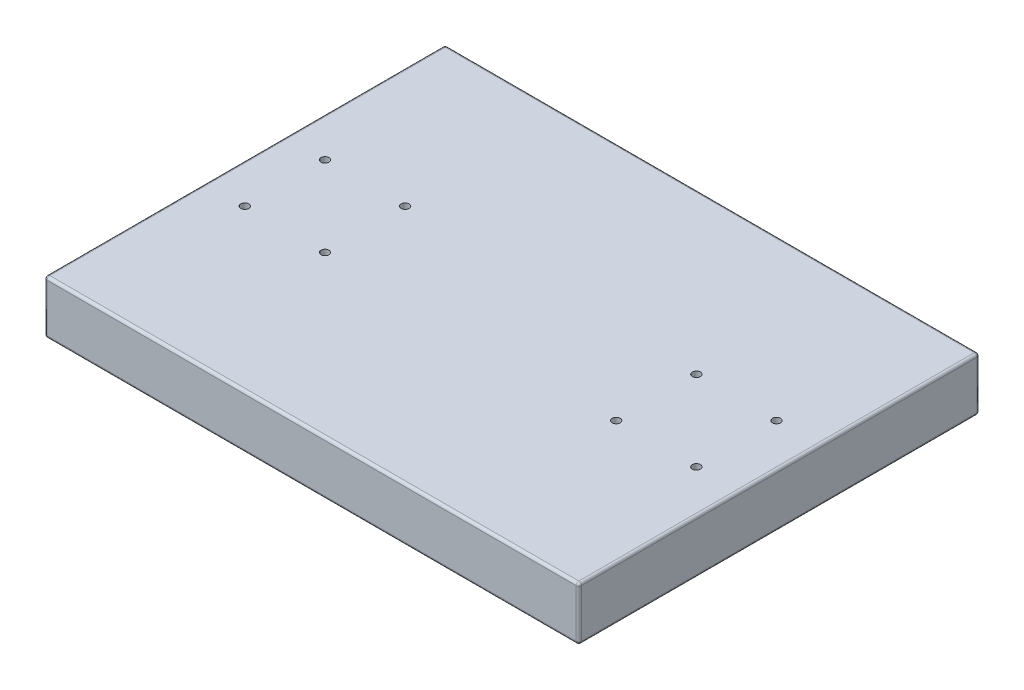
ISO-10303-21;
HEADER;
FILE_DESCRIPTION(('STEP AP214'),'2;1');
FILE_NAME('part.step','',(''),(''),'','','');
FILE_SCHEMA(('AUTOMOTIVE_DESIGN { 1 0 10303 214 1 1 1 1 }'));
ENDSEC;
DATA;
#1=APPLICATION_CONTEXT('core data for automotive mechanical design processes');
#2=APPLICATION_PROTOCOL_DEFINITION('international standard','automotive_design',2000,#1);
#3=PRODUCT_CONTEXT('',#1,'mechanical');
#4=PRODUCT('Part','Part','',(#3));
#5=PRODUCT_RELATED_PRODUCT_CATEGORY('part','',(#4));
#6=PRODUCT_DEFINITION_FORMATION('','',#4);
#7=PRODUCT_DEFINITION_CONTEXT('part definition',#1,'design');
#8=PRODUCT_DEFINITION('design','',#6,#7);
#9=PRODUCT_DEFINITION_SHAPE('','',#8);
#10=(LENGTH_UNIT() NAMED_UNIT(*) SI_UNIT(.MILLI.,.METRE.));
#11=(NAMED_UNIT(*) PLANE_ANGLE_UNIT() SI_UNIT($,.RADIAN.));
#12=(NAMED_UNIT(*) SI_UNIT($,.STERADIAN.) SOLID_ANGLE_UNIT());
#13=UNCERTAINTY_MEASURE_WITH_UNIT(LENGTH_MEASURE(1.E-05),#10,'distance_accuracy_value','');
#14=(GEOMETRIC_REPRESENTATION_CONTEXT(3) GLOBAL_UNCERTAINTY_ASSIGNED_CONTEXT((#13)) GLOBAL_UNIT_ASSIGNED_CONTEXT((#10,
#11,#12)) REPRESENTATION_CONTEXT('',''));
#15=CARTESIAN_POINT('',(0.,0.,0.));
#16=DIRECTION('',(0.,0.,1.));
#17=DIRECTION('',(1.,0.,0.));
#18=AXIS2_PLACEMENT_3D('',#15,#16,#17);
#19=CARTESIAN_POINT('',(100.,20.,75.));
#20=DIRECTION('',(-1.,0.,0.));
#21=DIRECTION('',(0.,0.,1.));
#22=AXIS2_PLACEMENT_3D('',#19,#20,#21);
#23=PLANE('',#22);
#24=DIRECTION('',(0.,0.,-1.));
#25=VECTOR('',#24,1.);
#26=CARTESIAN_POINT('',(100.,19.,75.));
#27=LINE('',#26,#25);
#28=CARTESIAN_POINT('',(100.,19.,-74.));
#29=VERTEX_POINT('',#28);
#30=CARTESIAN_POINT('',(100.,19.,74.));
#31=VERTEX_POINT('',#30);
#32=EDGE_CURVE('E175',#29,#31,#27,.F.);
#33=ORIENTED_EDGE('',*,*,#32,.T.);
#34=DIRECTION('',(0.,-1.,0.));
#35=VECTOR('',#34,1.);
#36=CARTESIAN_POINT('',(100.,20.,74.));
#37=LINE('',#36,#35);
#38=CARTESIAN_POINT('',(100.,1.,74.));
#39=VERTEX_POINT('',#38);
#40=EDGE_CURVE('E144',#31,#39,#37,.T.);
#41=ORIENTED_EDGE('',*,*,#40,.T.);
#42=DIRECTION('',(0.,0.,-1.));
#43=VECTOR('',#42,1.);
#44=CARTESIAN_POINT('',(100.,1.,-75.));
#45=LINE('',#44,#43);
#46=CARTESIAN_POINT('',(100.,1.,-74.));
#47=VERTEX_POINT('',#46);
#48=EDGE_CURVE('E164',#39,#47,#45,.T.);
#49=ORIENTED_EDGE('',*,*,#48,.T.);
#50=DIRECTION('',(0.,-1.,0.));
#51=VECTOR('',#50,1.);
#52=CARTESIAN_POINT('',(100.,20.,-74.));
#53=LINE('',#52,#51);
#54=EDGE_CURVE('E171',#47,#29,#53,.F.);
#55=ORIENTED_EDGE('',*,*,#54,.T.);
#56=EDGE_LOOP('',(#33,#41,#49,#55));
#57=FACE_BOUND('',#56,.T.);
#58=ADVANCED_FACE('F46',(#57),#23,.F.);
#59=CARTESIAN_POINT('',(-100.,20.,-75.));
#60=DIRECTION('',(0.,0.,1.));
#61=DIRECTION('',(1.,0.,0.));
#62=AXIS2_PLACEMENT_3D('',#59,#60,#61);
#63=PLANE('',#62);
#64=DIRECTION('',(0.,-1.,0.));
#65=VECTOR('',#64,1.);
#66=CARTESIAN_POINT('',(99.,20.,-75.));
#67=LINE('',#66,#65);
#68=CARTESIAN_POINT('',(99.,19.,-75.));
#69=VERTEX_POINT('',#68);
#70=CARTESIAN_POINT('',(99.,1.,-75.));
#71=VERTEX_POINT('',#70);
#72=EDGE_CURVE('E211',#69,#71,#67,.T.);
#73=ORIENTED_EDGE('',*,*,#72,.T.);
#74=DIRECTION('',(-1.,0.,0.));
#75=VECTOR('',#74,1.);
#76=CARTESIAN_POINT('',(-100.,1.,-75.));
#77=LINE('',#76,#75);
#78=CARTESIAN_POINT('',(-99.,1.,-75.));
#79=VERTEX_POINT('',#78);
#80=EDGE_CURVE('E215',#71,#79,#77,.T.);
#81=ORIENTED_EDGE('',*,*,#80,.T.);
#82=DIRECTION('',(0.,-1.,0.));
#83=VECTOR('',#82,1.);
#84=CARTESIAN_POINT('',(-99.,20.,-75.));
#85=LINE('',#84,#83);
#86=CARTESIAN_POINT('',(-99.,19.,-75.));
#87=VERTEX_POINT('',#86);
#88=EDGE_CURVE('E208',#79,#87,#85,.F.);
#89=ORIENTED_EDGE('',*,*,#88,.T.);
#90=DIRECTION('',(-1.,0.,0.));
#91=VECTOR('',#90,1.);
#92=CARTESIAN_POINT('',(-100.,19.,-75.));
#93=LINE('',#92,#91);
#94=EDGE_CURVE('E205',#87,#69,#93,.F.);
#95=ORIENTED_EDGE('',*,*,#94,.T.);
#96=EDGE_LOOP('',(#73,#81,#89,#95));
#97=FACE_BOUND('',#96,.T.);
#98=ADVANCED_FACE('F378',(#97),#63,.F.);
#99=CARTESIAN_POINT('',(-100.,20.,75.));
#100=DIRECTION('',(1.,0.,0.));
#101=DIRECTION('',(0.,0.,-1.));
#102=AXIS2_PLACEMENT_3D('',#99,#100,#101);
#103=PLANE('',#102);
#104=DIRECTION('',(0.,0.,1.));
#105=VECTOR('',#104,1.);
#106=CARTESIAN_POINT('',(-100.,1.,75.));
#107=LINE('',#106,#105);
#108=CARTESIAN_POINT('',(-100.,1.,-74.));
#109=VERTEX_POINT('',#108);
#110=CARTESIAN_POINT('',(-100.,1.,74.));
#111=VERTEX_POINT('',#110);
#112=EDGE_CURVE('E238',#109,#111,#107,.T.);
#113=ORIENTED_EDGE('',*,*,#112,.T.);
#114=DIRECTION('',(0.,-1.,0.));
#115=VECTOR('',#114,1.);
#116=CARTESIAN_POINT('',(-100.,20.,74.));
#117=LINE('',#116,#115);
#118=CARTESIAN_POINT('',(-100.,19.,74.));
#119=VERTEX_POINT('',#118);
#120=EDGE_CURVE('E11',#111,#119,#117,.F.);
#121=ORIENTED_EDGE('',*,*,#120,.T.);
#122=DIRECTION('',(0.,0.,1.));
#123=VECTOR('',#122,1.);
#124=CARTESIAN_POINT('',(-100.,19.,75.));
#125=LINE('',#124,#123);
#126=CARTESIAN_POINT('',(-100.,19.,-74.));
#127=VERTEX_POINT('',#126);
#128=EDGE_CURVE('E232',#119,#127,#125,.F.);
#129=ORIENTED_EDGE('',*,*,#128,.T.);
#130=DIRECTION('',(0.,-1.,0.));
#131=VECTOR('',#130,1.);
#132=CARTESIAN_POINT('',(-100.,20.,-74.));
#133=LINE('',#132,#131);
#134=EDGE_CURVE('E235',#127,#109,#133,.T.);
#135=ORIENTED_EDGE('',*,*,#134,.T.);
#136=EDGE_LOOP('',(#113,#121,#129,#135));
#137=FACE_BOUND('',#136,.T.);
#138=ADVANCED_FACE('F383',(#137),#103,.F.);
#139=CARTESIAN_POINT('',(-100.,20.,75.));
#140=DIRECTION('',(0.,0.,-1.));
#141=DIRECTION('',(-1.,0.,0.));
#142=AXIS2_PLACEMENT_3D('',#139,#140,#141);
#143=PLANE('',#142);
#144=DIRECTION('',(1.,0.,0.));
#145=VECTOR('',#144,1.);
#146=CARTESIAN_POINT('',(-100.,19.,75.));
#147=LINE('',#146,#145);
#148=CARTESIAN_POINT('',(99.,19.,75.));
#149=VERTEX_POINT('',#148);
#150=CARTESIAN_POINT('',(-99.,19.,75.));
#151=VERTEX_POINT('',#150);
#152=EDGE_CURVE('E178',#149,#151,#147,.F.);
#153=ORIENTED_EDGE('',*,*,#152,.T.);
#154=DIRECTION('',(0.,-1.,0.));
#155=VECTOR('',#154,1.);
#156=CARTESIAN_POINT('',(-99.,20.,75.));
#157=LINE('',#156,#155);
#158=CARTESIAN_POINT('',(-99.,1.,75.));
#159=VERTEX_POINT('',#158);
#160=EDGE_CURVE('E56',#151,#159,#157,.T.);
#161=ORIENTED_EDGE('',*,*,#160,.T.);
#162=DIRECTION('',(1.,0.,0.));
#163=VECTOR('',#162,1.);
#164=CARTESIAN_POINT('',(100.,1.,75.));
#165=LINE('',#164,#163);
#166=CARTESIAN_POINT('',(99.,1.,75.));
#167=VERTEX_POINT('',#166);
#168=EDGE_CURVE('E188',#159,#167,#165,.T.);
#169=ORIENTED_EDGE('',*,*,#168,.T.);
#170=DIRECTION('',(0.,-1.,0.));
#171=VECTOR('',#170,1.);
#172=CARTESIAN_POINT('',(99.,20.,75.));
#173=LINE('',#172,#171);
#174=EDGE_CURVE('E146',#167,#149,#173,.F.);
#175=ORIENTED_EDGE('',*,*,#174,.T.);
#176=EDGE_LOOP('',(#153,#161,#169,#175));
#177=FACE_BOUND('',#176,.T.);
#178=ADVANCED_FACE('F352',(#177),#143,.F.);
#179=CARTESIAN_POINT('',(0.,20.,0.));
#180=DIRECTION('',(0.,-1.,0.));
#181=DIRECTION('',(0.,0.,-1.));
#182=AXIS2_PLACEMENT_3D('',#179,#180,#181);
#183=PLANE('',#182);
#184=CARTESIAN_POINT('',(-55.,20.,-15.));
#185=DIRECTION('',(0.,1.,0.));
#186=DIRECTION('',(0.,0.,1.));
#187=AXIS2_PLACEMENT_3D('',#184,#185,#186);
#188=CIRCLE('',#187,1.5);
#189=CARTESIAN_POINT('',(-55.,20.,-13.5));
#190=VERTEX_POINT('',#189);
#191=EDGE_CURVE('E697',#190,#190,#188,.T.);
#192=ORIENTED_EDGE('',*,*,#191,.F.);
#193=EDGE_LOOP('',(#192));
#194=FACE_BOUND('',#193,.T.);
#195=CARTESIAN_POINT('',(-85.,20.,15.));
#196=DIRECTION('',(0.,1.,0.));
#197=DIRECTION('',(0.,0.,1.));
#198=AXIS2_PLACEMENT_3D('',#195,#196,#197);
#199=CIRCLE('',#198,1.5);
#200=CARTESIAN_POINT('',(-85.,20.,16.5));
#201=VERTEX_POINT('',#200);
#202=EDGE_CURVE('E706',#201,#201,#199,.T.);
#203=ORIENTED_EDGE('',*,*,#202,.F.);
#204=EDGE_LOOP('',(#203));
#205=FACE_BOUND('',#204,.T.);
#206=CARTESIAN_POINT('',(-55.,20.,15.));
#207=DIRECTION('',(0.,1.,0.));
#208=DIRECTION('',(0.,0.,1.));
#209=AXIS2_PLACEMENT_3D('',#206,#207,#208);
#210=CIRCLE('',#209,1.5);
#211=CARTESIAN_POINT('',(-55.,20.,16.5));
#212=VERTEX_POINT('',#211);
#213=EDGE_CURVE('E719',#212,#212,#210,.T.);
#214=ORIENTED_EDGE('',*,*,#213,.F.);
#215=EDGE_LOOP('',(#214));
#216=FACE_BOUND('',#215,.T.);
#217=CARTESIAN_POINT('',(-85.,20.,-15.));
#218=DIRECTION('',(0.,1.,0.));
#219=DIRECTION('',(0.,0.,1.));
#220=AXIS2_PLACEMENT_3D('',#217,#218,#219);
#221=CIRCLE('',#220,1.5);
#222=CARTESIAN_POINT('',(-85.,20.,-13.5));
#223=VERTEX_POINT('',#222);
#224=EDGE_CURVE('E699',#223,#223,#221,.T.);
#225=ORIENTED_EDGE('',*,*,#224,.F.);
#226=EDGE_LOOP('',(#225));
#227=FACE_BOUND('',#226,.T.);
#228=CARTESIAN_POINT('',(84.,20.,15.));
#229=DIRECTION('',(0.,1.,0.));
#230=DIRECTION('',(0.,0.,1.));
#231=AXIS2_PLACEMENT_3D('',#228,#229,#230);
#232=CIRCLE('',#231,1.5);
#233=CARTESIAN_POINT('',(84.,20.,16.5));
#234=VERTEX_POINT('',#233);
#235=EDGE_CURVE('E737',#234,#234,#232,.T.);
#236=ORIENTED_EDGE('',*,*,#235,.F.);
#237=EDGE_LOOP('',(#236));
#238=FACE_BOUND('',#237,.T.);
#239=CARTESIAN_POINT('',(54.,20.,15.));
#240=DIRECTION('',(0.,1.,0.));
#241=DIRECTION('',(0.,0.,1.));
#242=AXIS2_PLACEMENT_3D('',#239,#240,#241);
#243=CIRCLE('',#242,1.5);
#244=CARTESIAN_POINT('',(54.,20.,16.5));
#245=VERTEX_POINT('',#244);
#246=EDGE_CURVE('E730',#245,#245,#243,.T.);
#247=ORIENTED_EDGE('',*,*,#246,.F.);
#248=EDGE_LOOP('',(#247));
#249=FACE_BOUND('',#248,.T.);
#250=CARTESIAN_POINT('',(54.,20.,-15.));
#251=DIRECTION('',(0.,1.,0.));
#252=DIRECTION('',(0.,0.,1.));
#253=AXIS2_PLACEMENT_3D('',#250,#251,#252);
#254=CIRCLE('',#253,1.5);
#255=CARTESIAN_POINT('',(54.,20.,-13.5));
#256=VERTEX_POINT('',#255);
#257=EDGE_CURVE('E325',#256,#256,#254,.T.);
#258=ORIENTED_EDGE('',*,*,#257,.F.);
#259=EDGE_LOOP('',(#258));
#260=FACE_BOUND('',#259,.T.);
#261=CARTESIAN_POINT('',(84.,20.,-15.));
#262=DIRECTION('',(0.,1.,0.));
#263=DIRECTION('',(0.,0.,1.));
#264=AXIS2_PLACEMENT_3D('',#261,#262,#263);
#265=CIRCLE('',#264,1.5);
#266=CARTESIAN_POINT('',(84.,20.,-13.5));
#267=VERTEX_POINT('',#266);
#268=EDGE_CURVE('E319',#267,#267,#265,.T.);
#269=ORIENTED_EDGE('',*,*,#268,.F.);
#270=EDGE_LOOP('',(#269));
#271=FACE_BOUND('',#270,.T.);
#272=DIRECTION('',(1.,0.,0.));
#273=VECTOR('',#272,1.);
#274=CARTESIAN_POINT('',(0.,20.,74.));
#275=LINE('',#274,#273);
#276=CARTESIAN_POINT('',(-99.,20.,74.));
#277=VERTEX_POINT('',#276);
#278=CARTESIAN_POINT('',(99.,20.,74.));
#279=VERTEX_POINT('',#278);
#280=EDGE_CURVE('E198',#277,#279,#275,.T.);
#281=ORIENTED_EDGE('',*,*,#280,.T.);
#282=DIRECTION('',(0.,0.,-1.));
#283=VECTOR('',#282,1.);
#284=CARTESIAN_POINT('',(99.,20.,0.));
#285=LINE('',#284,#283);
#286=CARTESIAN_POINT('',(99.,20.,-74.));
#287=VERTEX_POINT('',#286);
#288=EDGE_CURVE('E201',#279,#287,#285,.T.);
#289=ORIENTED_EDGE('',*,*,#288,.T.);
#290=DIRECTION('',(-1.,0.,0.));
#291=VECTOR('',#290,1.);
#292=CARTESIAN_POINT('',(0.,20.,-74.));
#293=LINE('',#292,#291);
#294=CARTESIAN_POINT('',(-99.,20.,-74.));
#295=VERTEX_POINT('',#294);
#296=EDGE_CURVE('E195',#287,#295,#293,.T.);
#297=ORIENTED_EDGE('',*,*,#296,.T.);
#298=DIRECTION('',(0.,0.,1.));
#299=VECTOR('',#298,1.);
#300=CARTESIAN_POINT('',(-99.,20.,0.));
#301=LINE('',#300,#299);
#302=EDGE_CURVE('E191',#295,#277,#301,.T.);
#303=ORIENTED_EDGE('',*,*,#302,.T.);
#304=EDGE_LOOP('',(#281,#289,#297,#303));
#305=FACE_BOUND('',#304,.T.);
#306=ADVANCED_FACE('F479',(#194,#205,#216,#227,#238,#249,#260,#271,#305),#183,.F.);
#307=CARTESIAN_POINT('',(0.,0.,0.));
#308=DIRECTION('',(0.,-1.,0.));
#309=DIRECTION('',(0.,0.,-1.));
#310=AXIS2_PLACEMENT_3D('',#307,#308,#309);
#311=PLANE('',#310);
#312=CARTESIAN_POINT('',(-55.,0.,-15.));
#313=DIRECTION('',(0.,1.,0.));
#314=DIRECTION('',(0.,0.,1.));
#315=AXIS2_PLACEMENT_3D('',#312,#313,#314);
#316=CIRCLE('',#315,1.5);
#317=CARTESIAN_POINT('',(-55.,0.,-13.5));
#318=VERTEX_POINT('',#317);
#319=EDGE_CURVE('E694',#318,#318,#316,.T.);
#320=ORIENTED_EDGE('',*,*,#319,.T.);
#321=EDGE_LOOP('',(#320));
#322=FACE_BOUND('',#321,.T.);
#323=CARTESIAN_POINT('',(-85.,0.,15.));
#324=DIRECTION('',(0.,1.,0.));
#325=DIRECTION('',(0.,0.,1.));
#326=AXIS2_PLACEMENT_3D('',#323,#324,#325);
#327=CIRCLE('',#326,1.5);
#328=CARTESIAN_POINT('',(-85.,0.,16.5));
#329=VERTEX_POINT('',#328);
#330=EDGE_CURVE('E715',#329,#329,#327,.T.);
#331=ORIENTED_EDGE('',*,*,#330,.T.);
#332=EDGE_LOOP('',(#331));
#333=FACE_BOUND('',#332,.T.);
#334=CARTESIAN_POINT('',(-55.,0.,15.));
#335=DIRECTION('',(0.,1.,0.));
#336=DIRECTION('',(0.,0.,1.));
#337=AXIS2_PLACEMENT_3D('',#334,#335,#336);
#338=CIRCLE('',#337,1.5);
#339=CARTESIAN_POINT('',(-55.,0.,16.5));
#340=VERTEX_POINT('',#339);
#341=EDGE_CURVE('E709',#340,#340,#338,.T.);
#342=ORIENTED_EDGE('',*,*,#341,.T.);
#343=EDGE_LOOP('',(#342));
#344=FACE_BOUND('',#343,.T.);
#345=CARTESIAN_POINT('',(-85.,0.,-15.));
#346=DIRECTION('',(0.,1.,0.));
#347=DIRECTION('',(0.,0.,1.));
#348=AXIS2_PLACEMENT_3D('',#345,#346,#347);
#349=CIRCLE('',#348,1.5);
#350=CARTESIAN_POINT('',(-85.,0.,-13.5));
#351=VERTEX_POINT('',#350);
#352=EDGE_CURVE('E704',#351,#351,#349,.T.);
#353=ORIENTED_EDGE('',*,*,#352,.T.);
#354=EDGE_LOOP('',(#353));
#355=FACE_BOUND('',#354,.T.);
#356=CARTESIAN_POINT('',(84.,0.,15.));
#357=DIRECTION('',(0.,1.,0.));
#358=DIRECTION('',(0.,0.,1.));
#359=AXIS2_PLACEMENT_3D('',#356,#357,#358);
#360=CIRCLE('',#359,1.5);
#361=CARTESIAN_POINT('',(84.,0.,16.5));
#362=VERTEX_POINT('',#361);
#363=EDGE_CURVE('E328',#362,#362,#360,.T.);
#364=ORIENTED_EDGE('',*,*,#363,.T.);
#365=EDGE_LOOP('',(#364));
#366=FACE_BOUND('',#365,.T.);
#367=CARTESIAN_POINT('',(54.,0.,15.));
#368=DIRECTION('',(0.,1.,0.));
#369=DIRECTION('',(0.,0.,1.));
#370=AXIS2_PLACEMENT_3D('',#367,#368,#369);
#371=CIRCLE('',#370,1.5);
#372=CARTESIAN_POINT('',(54.,0.,16.5));
#373=VERTEX_POINT('',#372);
#374=EDGE_CURVE('E734',#373,#373,#371,.T.);
#375=ORIENTED_EDGE('',*,*,#374,.T.);
#376=EDGE_LOOP('',(#375));
#377=FACE_BOUND('',#376,.T.);
#378=CARTESIAN_POINT('',(54.,0.,-15.));
#379=DIRECTION('',(0.,1.,0.));
#380=DIRECTION('',(0.,0.,1.));
#381=AXIS2_PLACEMENT_3D('',#378,#379,#380);
#382=CIRCLE('',#381,1.5);
#383=CARTESIAN_POINT('',(54.,0.,-13.5));
#384=VERTEX_POINT('',#383);
#385=EDGE_CURVE('E726',#384,#384,#382,.T.);
#386=ORIENTED_EDGE('',*,*,#385,.T.);
#387=EDGE_LOOP('',(#386));
#388=FACE_BOUND('',#387,.T.);
#389=CARTESIAN_POINT('',(84.,0.,-15.));
#390=DIRECTION('',(0.,1.,0.));
#391=DIRECTION('',(0.,0.,1.));
#392=AXIS2_PLACEMENT_3D('',#389,#390,#391);
#393=CIRCLE('',#392,1.5);
#394=CARTESIAN_POINT('',(84.,0.,-13.5));
#395=VERTEX_POINT('',#394);
#396=EDGE_CURVE('E310',#395,#395,#393,.T.);
#397=ORIENTED_EDGE('',*,*,#396,.T.);
#398=EDGE_LOOP('',(#397));
#399=FACE_BOUND('',#398,.T.);
#400=DIRECTION('',(0.,0.,1.));
#401=VECTOR('',#400,1.);
#402=CARTESIAN_POINT('',(-99.,0.,-75.));
#403=LINE('',#402,#401);
#404=CARTESIAN_POINT('',(-99.,0.,74.));
#405=VERTEX_POINT('',#404);
#406=CARTESIAN_POINT('',(-99.,0.,-74.));
#407=VERTEX_POINT('',#406);
#408=EDGE_CURVE('E222',#405,#407,#403,.F.);
#409=ORIENTED_EDGE('',*,*,#408,.T.);
#410=DIRECTION('',(-1.,0.,0.));
#411=VECTOR('',#410,1.);
#412=CARTESIAN_POINT('',(100.,0.,-74.));
#413=LINE('',#412,#411);
#414=CARTESIAN_POINT('',(99.,0.,-74.));
#415=VERTEX_POINT('',#414);
#416=EDGE_CURVE('E229',#407,#415,#413,.F.);
#417=ORIENTED_EDGE('',*,*,#416,.T.);
#418=DIRECTION('',(0.,0.,-1.));
#419=VECTOR('',#418,1.);
#420=CARTESIAN_POINT('',(99.,0.,75.));
#421=LINE('',#420,#419);
#422=CARTESIAN_POINT('',(99.,0.,74.));
#423=VERTEX_POINT('',#422);
#424=EDGE_CURVE('E225',#415,#423,#421,.F.);
#425=ORIENTED_EDGE('',*,*,#424,.T.);
#426=DIRECTION('',(1.,0.,0.));
#427=VECTOR('',#426,1.);
#428=CARTESIAN_POINT('',(-100.,0.,74.));
#429=LINE('',#428,#427);
#430=EDGE_CURVE('E218',#423,#405,#429,.F.);
#431=ORIENTED_EDGE('',*,*,#430,.T.);
#432=EDGE_LOOP('',(#409,#417,#425,#431));
#433=FACE_BOUND('',#432,.T.);
#434=ADVANCED_FACE('F357',(#322,#333,#344,#355,#366,#377,#388,#399,#433),#311,.T.);
#435=CARTESIAN_POINT('',(-99.,20.,-74.));
#436=DIRECTION('',(0.,-1.,0.));
#437=DIRECTION('',(0.,0.,-1.));
#438=AXIS2_PLACEMENT_3D('',#435,#436,#437);
#439=CYLINDRICAL_SURFACE('',#438,1.);
#440=CARTESIAN_POINT('',(-99.,19.,-74.));
#441=DIRECTION('',(0.,1.,0.));
#442=DIRECTION('',(0.,0.,1.));
#443=AXIS2_PLACEMENT_3D('',#440,#441,#442);
#444=CIRCLE('',#443,1.);
#445=EDGE_CURVE('E172',#87,#127,#444,.T.);
#446=ORIENTED_EDGE('',*,*,#445,.F.);
#447=ORIENTED_EDGE('',*,*,#88,.F.);
#448=CARTESIAN_POINT('',(-99.,1.,-74.));
#449=DIRECTION('',(0.,-1.,0.));
#450=DIRECTION('',(0.,0.,-1.));
#451=AXIS2_PLACEMENT_3D('',#448,#449,#450);
#452=CIRCLE('',#451,1.);
#453=EDGE_CURVE('E281',#109,#79,#452,.T.);
#454=ORIENTED_EDGE('',*,*,#453,.F.);
#455=ORIENTED_EDGE('',*,*,#134,.F.);
#456=EDGE_LOOP('',(#446,#447,#454,#455));
#457=FACE_BOUND('',#456,.T.);
#458=ADVANCED_FACE('F492',(#457),#439,.T.);
#459=CARTESIAN_POINT('',(-99.,19.,-74.));
#460=DIRECTION('',(0.,0.,-1.));
#461=DIRECTION('',(-1.,0.,0.));
#462=AXIS2_PLACEMENT_3D('',#459,#460,#461);
#463=SPHERICAL_SURFACE('',#462,1.);
#464=CARTESIAN_POINT('',(-99.,19.,-74.));
#465=DIRECTION('',(0.,0.,-1.));
#466=DIRECTION('',(-1.,0.,0.));
#467=AXIS2_PLACEMENT_3D('',#464,#465,#466);
#468=CIRCLE('',#467,1.);
#469=EDGE_CURVE('E277',#295,#127,#468,.F.);
#470=ORIENTED_EDGE('',*,*,#469,.F.);
#471=CARTESIAN_POINT('',(-99.,19.,-74.));
#472=DIRECTION('',(-1.,0.,0.));
#473=DIRECTION('',(0.,0.,1.));
#474=AXIS2_PLACEMENT_3D('',#471,#472,#473);
#475=CIRCLE('',#474,1.);
#476=EDGE_CURVE('E289',#87,#295,#475,.F.);
#477=ORIENTED_EDGE('',*,*,#476,.F.);
#478=ORIENTED_EDGE('',*,*,#445,.T.);
#479=EDGE_LOOP('',(#470,#477,#478));
#480=FACE_BOUND('',#479,.T.);
#481=ADVANCED_FACE('F619',(#480),#463,.T.);
#482=CARTESIAN_POINT('',(0.,19.,-74.));
#483=DIRECTION('',(-1.,0.,0.));
#484=DIRECTION('',(0.,0.,1.));
#485=AXIS2_PLACEMENT_3D('',#482,#483,#484);
#486=CYLINDRICAL_SURFACE('',#485,1.);
#487=ORIENTED_EDGE('',*,*,#476,.T.);
#488=ORIENTED_EDGE('',*,*,#296,.F.);
#489=CARTESIAN_POINT('',(99.,19.,-74.));
#490=DIRECTION('',(1.,0.,0.));
#491=DIRECTION('',(0.,0.,-1.));
#492=AXIS2_PLACEMENT_3D('',#489,#490,#491);
#493=CIRCLE('',#492,1.);
#494=EDGE_CURVE('E273',#69,#287,#493,.T.);
#495=ORIENTED_EDGE('',*,*,#494,.F.);
#496=ORIENTED_EDGE('',*,*,#94,.F.);
#497=EDGE_LOOP('',(#487,#488,#495,#496));
#498=FACE_BOUND('',#497,.T.);
#499=ADVANCED_FACE('F611',(#498),#486,.T.);
#500=CARTESIAN_POINT('',(99.,20.,-74.));
#501=DIRECTION('',(0.,-1.,0.));
#502=DIRECTION('',(0.,0.,-1.));
#503=AXIS2_PLACEMENT_3D('',#500,#501,#502);
#504=CYLINDRICAL_SURFACE('',#503,1.);
#505=CARTESIAN_POINT('',(99.,1.,-74.));
#506=DIRECTION('',(0.,-1.,0.));
#507=DIRECTION('',(0.,0.,-1.));
#508=AXIS2_PLACEMENT_3D('',#505,#506,#507);
#509=CIRCLE('',#508,1.);
#510=EDGE_CURVE('E265',#71,#47,#509,.T.);
#511=ORIENTED_EDGE('',*,*,#510,.F.);
#512=ORIENTED_EDGE('',*,*,#72,.F.);
#513=CARTESIAN_POINT('',(99.,19.,-74.));
#514=DIRECTION('',(0.,1.,0.));
#515=DIRECTION('',(0.,0.,1.));
#516=AXIS2_PLACEMENT_3D('',#513,#514,#515);
#517=CIRCLE('',#516,1.);
#518=EDGE_CURVE('E269',#29,#69,#517,.T.);
#519=ORIENTED_EDGE('',*,*,#518,.F.);
#520=ORIENTED_EDGE('',*,*,#54,.F.);
#521=EDGE_LOOP('',(#511,#512,#519,#520));
#522=FACE_BOUND('',#521,.T.);
#523=ADVANCED_FACE('F336',(#522),#504,.T.);
#524=CARTESIAN_POINT('',(-100.,1.,-74.));
#525=DIRECTION('',(1.,0.,0.));
#526=DIRECTION('',(0.,0.,-1.));
#527=AXIS2_PLACEMENT_3D('',#524,#525,#526);
#528=CYLINDRICAL_SURFACE('',#527,1.);
#529=CARTESIAN_POINT('',(-99.,1.,-74.));
#530=DIRECTION('',(-1.,0.,0.));
#531=DIRECTION('',(0.,0.,1.));
#532=AXIS2_PLACEMENT_3D('',#529,#530,#531);
#533=CIRCLE('',#532,1.);
#534=EDGE_CURVE('E285',#79,#407,#533,.T.);
#535=ORIENTED_EDGE('',*,*,#534,.F.);
#536=ORIENTED_EDGE('',*,*,#80,.F.);
#537=CARTESIAN_POINT('',(99.,1.,-74.));
#538=DIRECTION('',(1.,0.,0.));
#539=DIRECTION('',(0.,0.,-1.));
#540=AXIS2_PLACEMENT_3D('',#537,#538,#539);
#541=CIRCLE('',#540,1.);
#542=EDGE_CURVE('E262',#415,#71,#541,.T.);
#543=ORIENTED_EDGE('',*,*,#542,.F.);
#544=ORIENTED_EDGE('',*,*,#416,.F.);
#545=EDGE_LOOP('',(#535,#536,#543,#544));
#546=FACE_BOUND('',#545,.T.);
#547=ADVANCED_FACE('F363',(#546),#528,.T.);
#548=CARTESIAN_POINT('',(-99.,1.,-74.));
#549=DIRECTION('',(0.,0.,-1.));
#550=DIRECTION('',(0.,1.,0.));
#551=AXIS2_PLACEMENT_3D('',#548,#549,#550);
#552=SPHERICAL_SURFACE('',#551,1.);
#553=ORIENTED_EDGE('',*,*,#453,.T.);
#554=ORIENTED_EDGE('',*,*,#534,.T.);
#555=CARTESIAN_POINT('',(-99.,1.,-74.));
#556=DIRECTION('',(0.,0.,-1.));
#557=DIRECTION('',(-1.,0.,0.));
#558=AXIS2_PLACEMENT_3D('',#555,#556,#557);
#559=CIRCLE('',#558,1.);
#560=EDGE_CURVE('E258',#109,#407,#559,.F.);
#561=ORIENTED_EDGE('',*,*,#560,.F.);
#562=EDGE_LOOP('',(#553,#554,#561));
#563=FACE_BOUND('',#562,.T.);
#564=ADVANCED_FACE('F587',(#563),#552,.T.);
#565=CARTESIAN_POINT('',(-99.,19.,0.));
#566=DIRECTION('',(0.,0.,1.));
#567=DIRECTION('',(1.,0.,0.));
#568=AXIS2_PLACEMENT_3D('',#565,#566,#567);
#569=CYLINDRICAL_SURFACE('',#568,1.);
#570=ORIENTED_EDGE('',*,*,#128,.F.);
#571=CARTESIAN_POINT('',(-99.,19.,74.));
#572=DIRECTION('',(0.,0.,1.));
#573=DIRECTION('',(1.,0.,0.));
#574=AXIS2_PLACEMENT_3D('',#571,#572,#573);
#575=CIRCLE('',#574,1.);
#576=EDGE_CURVE('E299',#119,#277,#575,.F.);
#577=ORIENTED_EDGE('',*,*,#576,.T.);
#578=ORIENTED_EDGE('',*,*,#302,.F.);
#579=ORIENTED_EDGE('',*,*,#469,.T.);
#580=EDGE_LOOP('',(#570,#577,#578,#579));
#581=FACE_BOUND('',#580,.T.);
#582=ADVANCED_FACE('F375',(#581),#569,.T.);
#583=CARTESIAN_POINT('',(99.,19.,-74.));
#584=DIRECTION('',(0.,0.,-1.));
#585=DIRECTION('',(-1.,0.,0.));
#586=AXIS2_PLACEMENT_3D('',#583,#584,#585);
#587=SPHERICAL_SURFACE('',#586,1.);
#588=ORIENTED_EDGE('',*,*,#518,.T.);
#589=ORIENTED_EDGE('',*,*,#494,.T.);
#590=CARTESIAN_POINT('',(99.,19.,-74.));
#591=DIRECTION('',(0.,0.,-1.));
#592=DIRECTION('',(-1.,0.,0.));
#593=AXIS2_PLACEMENT_3D('',#590,#591,#592);
#594=CIRCLE('',#593,1.);
#595=EDGE_CURVE('E255',#29,#287,#594,.F.);
#596=ORIENTED_EDGE('',*,*,#595,.F.);
#597=EDGE_LOOP('',(#588,#589,#596));
#598=FACE_BOUND('',#597,.T.);
#599=ADVANCED_FACE('F339',(#598),#587,.T.);
#600=CARTESIAN_POINT('',(99.,1.,-74.));
#601=DIRECTION('',(0.,0.,-1.));
#602=DIRECTION('',(0.,1.,0.));
#603=AXIS2_PLACEMENT_3D('',#600,#601,#602);
#604=SPHERICAL_SURFACE('',#603,1.);
#605=ORIENTED_EDGE('',*,*,#542,.T.);
#606=ORIENTED_EDGE('',*,*,#510,.T.);
#607=CARTESIAN_POINT('',(99.,1.,-74.));
#608=DIRECTION('',(0.,0.,-1.));
#609=DIRECTION('',(-1.,0.,0.));
#610=AXIS2_PLACEMENT_3D('',#607,#608,#609);
#611=CIRCLE('',#610,1.);
#612=EDGE_CURVE('E167',#415,#47,#611,.F.);
#613=ORIENTED_EDGE('',*,*,#612,.F.);
#614=EDGE_LOOP('',(#605,#606,#613));
#615=FACE_BOUND('',#614,.T.);
#616=ADVANCED_FACE('F365',(#615),#604,.T.);
#617=CARTESIAN_POINT('',(-99.,1.,75.));
#618=DIRECTION('',(0.,0.,-1.));
#619=DIRECTION('',(-1.,0.,0.));
#620=AXIS2_PLACEMENT_3D('',#617,#618,#619);
#621=CYLINDRICAL_SURFACE('',#620,1.);
#622=ORIENTED_EDGE('',*,*,#408,.F.);
#623=CARTESIAN_POINT('',(-99.,1.,74.));
#624=DIRECTION('',(0.,0.,-1.));
#625=DIRECTION('',(-1.,0.,0.));
#626=AXIS2_PLACEMENT_3D('',#623,#624,#625);
#627=CIRCLE('',#626,1.);
#628=EDGE_CURVE('E64',#405,#111,#627,.T.);
#629=ORIENTED_EDGE('',*,*,#628,.T.);
#630=ORIENTED_EDGE('',*,*,#112,.F.);
#631=ORIENTED_EDGE('',*,*,#560,.T.);
#632=EDGE_LOOP('',(#622,#629,#630,#631));
#633=FACE_BOUND('',#632,.T.);
#634=ADVANCED_FACE('F367',(#633),#621,.T.);
#635=CARTESIAN_POINT('',(0.,19.,74.));
#636=DIRECTION('',(1.,0.,0.));
#637=DIRECTION('',(0.,0.,-1.));
#638=AXIS2_PLACEMENT_3D('',#635,#636,#637);
#639=CYLINDRICAL_SURFACE('',#638,1.);
#640=ORIENTED_EDGE('',*,*,#280,.F.);
#641=CARTESIAN_POINT('',(-99.,19.,74.));
#642=DIRECTION('',(1.,0.,0.));
#643=DIRECTION('',(0.,0.,-1.));
#644=AXIS2_PLACEMENT_3D('',#641,#642,#643);
#645=CIRCLE('',#644,1.);
#646=EDGE_CURVE('E240',#277,#151,#645,.T.);
#647=ORIENTED_EDGE('',*,*,#646,.T.);
#648=ORIENTED_EDGE('',*,*,#152,.F.);
#649=CARTESIAN_POINT('',(99.,19.,74.));
#650=DIRECTION('',(1.,0.,0.));
#651=DIRECTION('',(0.,0.,-1.));
#652=AXIS2_PLACEMENT_3D('',#649,#650,#651);
#653=CIRCLE('',#652,1.);
#654=EDGE_CURVE('E249',#279,#149,#653,.T.);
#655=ORIENTED_EDGE('',*,*,#654,.F.);
#656=EDGE_LOOP('',(#640,#647,#648,#655));
#657=FACE_BOUND('',#656,.T.);
#658=ADVANCED_FACE('F351',(#657),#639,.T.);
#659=CARTESIAN_POINT('',(99.,19.,0.));
#660=DIRECTION('',(0.,0.,-1.));
#661=DIRECTION('',(-1.,0.,0.));
#662=AXIS2_PLACEMENT_3D('',#659,#660,#661);
#663=CYLINDRICAL_SURFACE('',#662,1.);
#664=ORIENTED_EDGE('',*,*,#595,.T.);
#665=ORIENTED_EDGE('',*,*,#288,.F.);
#666=CARTESIAN_POINT('',(99.,19.,74.));
#667=DIRECTION('',(0.,0.,1.));
#668=DIRECTION('',(1.,0.,0.));
#669=AXIS2_PLACEMENT_3D('',#666,#667,#668);
#670=CIRCLE('',#669,1.);
#671=EDGE_CURVE('E161',#31,#279,#670,.T.);
#672=ORIENTED_EDGE('',*,*,#671,.F.);
#673=ORIENTED_EDGE('',*,*,#32,.F.);
#674=EDGE_LOOP('',(#664,#665,#672,#673));
#675=FACE_BOUND('',#674,.T.);
#676=ADVANCED_FACE('F343',(#675),#663,.T.);
#677=CARTESIAN_POINT('',(99.,1.,75.));
#678=DIRECTION('',(0.,0.,1.));
#679=DIRECTION('',(1.,0.,0.));
#680=AXIS2_PLACEMENT_3D('',#677,#678,#679);
#681=CYLINDRICAL_SURFACE('',#680,1.);
#682=ORIENTED_EDGE('',*,*,#612,.T.);
#683=ORIENTED_EDGE('',*,*,#48,.F.);
#684=CARTESIAN_POINT('',(99.,1.,74.));
#685=DIRECTION('',(0.,0.,1.));
#686=DIRECTION('',(1.,0.,0.));
#687=AXIS2_PLACEMENT_3D('',#684,#685,#686);
#688=CIRCLE('',#687,1.);
#689=EDGE_CURVE('E152',#423,#39,#688,.T.);
#690=ORIENTED_EDGE('',*,*,#689,.F.);
#691=ORIENTED_EDGE('',*,*,#424,.F.);
#692=EDGE_LOOP('',(#682,#683,#690,#691));
#693=FACE_BOUND('',#692,.T.);
#694=ADVANCED_FACE('F165',(#693),#681,.T.);
#695=CARTESIAN_POINT('',(-100.,1.,74.));
#696=DIRECTION('',(-1.,0.,0.));
#697=DIRECTION('',(0.,0.,1.));
#698=AXIS2_PLACEMENT_3D('',#695,#696,#697);
#699=CYLINDRICAL_SURFACE('',#698,1.);
#700=ORIENTED_EDGE('',*,*,#168,.F.);
#701=CARTESIAN_POINT('',(-99.,1.,74.));
#702=DIRECTION('',(-1.,0.,0.));
#703=DIRECTION('',(0.,0.,1.));
#704=AXIS2_PLACEMENT_3D('',#701,#702,#703);
#705=CIRCLE('',#704,1.);
#706=EDGE_CURVE('E302',#159,#405,#705,.F.);
#707=ORIENTED_EDGE('',*,*,#706,.T.);
#708=ORIENTED_EDGE('',*,*,#430,.F.);
#709=CARTESIAN_POINT('',(99.,1.,74.));
#710=DIRECTION('',(1.,0.,0.));
#711=DIRECTION('',(0.,0.,-1.));
#712=AXIS2_PLACEMENT_3D('',#709,#710,#711);
#713=CIRCLE('',#712,1.);
#714=EDGE_CURVE('E156',#167,#423,#713,.T.);
#715=ORIENTED_EDGE('',*,*,#714,.F.);
#716=EDGE_LOOP('',(#700,#707,#708,#715));
#717=FACE_BOUND('',#716,.T.);
#718=ADVANCED_FACE('F355',(#717),#699,.T.);
#719=CARTESIAN_POINT('',(99.,19.,74.));
#720=DIRECTION('',(0.,1.,0.));
#721=DIRECTION('',(0.,0.,1.));
#722=AXIS2_PLACEMENT_3D('',#719,#720,#721);
#723=SPHERICAL_SURFACE('',#722,1.);
#724=ORIENTED_EDGE('',*,*,#671,.T.);
#725=ORIENTED_EDGE('',*,*,#654,.T.);
#726=CARTESIAN_POINT('',(99.,19.,74.));
#727=DIRECTION('',(0.,1.,0.));
#728=DIRECTION('',(0.,0.,1.));
#729=AXIS2_PLACEMENT_3D('',#726,#727,#728);
#730=CIRCLE('',#729,1.);
#731=EDGE_CURVE('E149',#31,#149,#730,.F.);
#732=ORIENTED_EDGE('',*,*,#731,.F.);
#733=EDGE_LOOP('',(#724,#725,#732));
#734=FACE_BOUND('',#733,.T.);
#735=ADVANCED_FACE('F347',(#734),#723,.T.);
#736=CARTESIAN_POINT('',(99.,1.,74.));
#737=DIRECTION('',(0.,-1.,0.));
#738=DIRECTION('',(0.,0.,-1.));
#739=AXIS2_PLACEMENT_3D('',#736,#737,#738);
#740=SPHERICAL_SURFACE('',#739,1.);
#741=ORIENTED_EDGE('',*,*,#714,.T.);
#742=ORIENTED_EDGE('',*,*,#689,.T.);
#743=CARTESIAN_POINT('',(99.,1.,74.));
#744=DIRECTION('',(0.,-1.,0.));
#745=DIRECTION('',(0.,0.,-1.));
#746=AXIS2_PLACEMENT_3D('',#743,#744,#745);
#747=CIRCLE('',#746,1.);
#748=EDGE_CURVE('E140',#167,#39,#747,.F.);
#749=ORIENTED_EDGE('',*,*,#748,.F.);
#750=EDGE_LOOP('',(#741,#742,#749));
#751=FACE_BOUND('',#750,.T.);
#752=ADVANCED_FACE('F154',(#751),#740,.T.);
#753=CARTESIAN_POINT('',(99.,20.,74.));
#754=DIRECTION('',(0.,-1.,0.));
#755=DIRECTION('',(0.,0.,-1.));
#756=AXIS2_PLACEMENT_3D('',#753,#754,#755);
#757=CYLINDRICAL_SURFACE('',#756,1.);
#758=ORIENTED_EDGE('',*,*,#731,.T.);
#759=ORIENTED_EDGE('',*,*,#174,.F.);
#760=ORIENTED_EDGE('',*,*,#748,.T.);
#761=ORIENTED_EDGE('',*,*,#40,.F.);
#762=EDGE_LOOP('',(#758,#759,#760,#761));
#763=FACE_BOUND('',#762,.T.);
#764=ADVANCED_FACE('F142',(#763),#757,.T.);
#765=CARTESIAN_POINT('',(-99.,1.,74.));
#766=DIRECTION('',(0.,0.,1.));
#767=DIRECTION('',(1.,0.,0.));
#768=AXIS2_PLACEMENT_3D('',#765,#766,#767);
#769=SPHERICAL_SURFACE('',#768,1.);
#770=ORIENTED_EDGE('',*,*,#628,.F.);
#771=ORIENTED_EDGE('',*,*,#706,.F.);
#772=CARTESIAN_POINT('',(-99.,1.,74.));
#773=DIRECTION('',(0.,1.,0.));
#774=DIRECTION('',(0.,0.,1.));
#775=AXIS2_PLACEMENT_3D('',#772,#773,#774);
#776=CIRCLE('',#775,1.);
#777=EDGE_CURVE('E50',#111,#159,#776,.T.);
#778=ORIENTED_EDGE('',*,*,#777,.F.);
#779=EDGE_LOOP('',(#770,#771,#778));
#780=FACE_BOUND('',#779,.T.);
#781=ADVANCED_FACE('F48',(#780),#769,.T.);
#782=CARTESIAN_POINT('',(-99.,20.,74.));
#783=DIRECTION('',(0.,-1.,0.));
#784=DIRECTION('',(0.,0.,-1.));
#785=AXIS2_PLACEMENT_3D('',#782,#783,#784);
#786=CYLINDRICAL_SURFACE('',#785,1.);
#787=ORIENTED_EDGE('',*,*,#777,.T.);
#788=ORIENTED_EDGE('',*,*,#160,.F.);
#789=CARTESIAN_POINT('',(-99.,19.,74.));
#790=DIRECTION('',(0.,1.,0.));
#791=DIRECTION('',(0.,0.,1.));
#792=AXIS2_PLACEMENT_3D('',#789,#790,#791);
#793=CIRCLE('',#792,1.);
#794=EDGE_CURVE('E308',#119,#151,#793,.T.);
#795=ORIENTED_EDGE('',*,*,#794,.F.);
#796=ORIENTED_EDGE('',*,*,#120,.F.);
#797=EDGE_LOOP('',(#787,#788,#795,#796));
#798=FACE_BOUND('',#797,.T.);
#799=ADVANCED_FACE('F420',(#798),#786,.T.);
#800=CARTESIAN_POINT('',(-99.,19.,74.));
#801=DIRECTION('',(0.,0.,1.));
#802=DIRECTION('',(1.,0.,0.));
#803=AXIS2_PLACEMENT_3D('',#800,#801,#802);
#804=SPHERICAL_SURFACE('',#803,1.);
#805=ORIENTED_EDGE('',*,*,#646,.F.);
#806=ORIENTED_EDGE('',*,*,#576,.F.);
#807=ORIENTED_EDGE('',*,*,#794,.T.);
#808=EDGE_LOOP('',(#805,#806,#807));
#809=FACE_BOUND('',#808,.T.);
#810=ADVANCED_FACE('F429',(#809),#804,.T.);
#811=CARTESIAN_POINT('',(84.,0.,-15.));
#812=DIRECTION('',(0.,1.,0.));
#813=DIRECTION('',(0.,0.,1.));
#814=AXIS2_PLACEMENT_3D('',#811,#812,#813);
#815=CYLINDRICAL_SURFACE('',#814,1.5);
#816=ORIENTED_EDGE('',*,*,#396,.F.);
#817=EDGE_LOOP('',(#816));
#818=FACE_BOUND('',#817,.T.);
#819=ORIENTED_EDGE('',*,*,#268,.T.);
#820=EDGE_LOOP('',(#819));
#821=FACE_BOUND('',#820,.T.);
#822=ADVANCED_FACE('F437',(#818,#821),#815,.F.);
#823=CARTESIAN_POINT('',(54.,0.,-15.));
#824=DIRECTION('',(0.,1.,0.));
#825=DIRECTION('',(0.,0.,1.));
#826=AXIS2_PLACEMENT_3D('',#823,#824,#825);
#827=CYLINDRICAL_SURFACE('',#826,1.5);
#828=ORIENTED_EDGE('',*,*,#385,.F.);
#829=EDGE_LOOP('',(#828));
#830=FACE_BOUND('',#829,.T.);
#831=ORIENTED_EDGE('',*,*,#257,.T.);
#832=EDGE_LOOP('',(#831));
#833=FACE_BOUND('',#832,.T.);
#834=ADVANCED_FACE('F445',(#830,#833),#827,.F.);
#835=CARTESIAN_POINT('',(54.,0.,15.));
#836=DIRECTION('',(0.,1.,0.));
#837=DIRECTION('',(0.,0.,1.));
#838=AXIS2_PLACEMENT_3D('',#835,#836,#837);
#839=CYLINDRICAL_SURFACE('',#838,1.5);
#840=ORIENTED_EDGE('',*,*,#374,.F.);
#841=EDGE_LOOP('',(#840));
#842=FACE_BOUND('',#841,.T.);
#843=ORIENTED_EDGE('',*,*,#246,.T.);
#844=EDGE_LOOP('',(#843));
#845=FACE_BOUND('',#844,.T.);
#846=ADVANCED_FACE('F454',(#842,#845),#839,.F.);
#847=CARTESIAN_POINT('',(84.,0.,15.));
#848=DIRECTION('',(0.,1.,0.));
#849=DIRECTION('',(0.,0.,1.));
#850=AXIS2_PLACEMENT_3D('',#847,#848,#849);
#851=CYLINDRICAL_SURFACE('',#850,1.5);
#852=ORIENTED_EDGE('',*,*,#363,.F.);
#853=EDGE_LOOP('',(#852));
#854=FACE_BOUND('',#853,.T.);
#855=ORIENTED_EDGE('',*,*,#235,.T.);
#856=EDGE_LOOP('',(#855));
#857=FACE_BOUND('',#856,.T.);
#858=ADVANCED_FACE('F463',(#854,#857),#851,.F.);
#859=CARTESIAN_POINT('',(-85.,0.,-15.));
#860=DIRECTION('',(0.,1.,0.));
#861=DIRECTION('',(0.,0.,1.));
#862=AXIS2_PLACEMENT_3D('',#859,#860,#861);
#863=CYLINDRICAL_SURFACE('',#862,1.5);
#864=ORIENTED_EDGE('',*,*,#352,.F.);
#865=EDGE_LOOP('',(#864));
#866=FACE_BOUND('',#865,.T.);
#867=ORIENTED_EDGE('',*,*,#224,.T.);
#868=EDGE_LOOP('',(#867));
#869=FACE_BOUND('',#868,.T.);
#870=ADVANCED_FACE('F472',(#866,#869),#863,.F.);
#871=CARTESIAN_POINT('',(-55.,0.,15.));
#872=DIRECTION('',(0.,1.,0.));
#873=DIRECTION('',(0.,0.,1.));
#874=AXIS2_PLACEMENT_3D('',#871,#872,#873);
#875=CYLINDRICAL_SURFACE('',#874,1.5);
#876=ORIENTED_EDGE('',*,*,#341,.F.);
#877=EDGE_LOOP('',(#876));
#878=FACE_BOUND('',#877,.T.);
#879=ORIENTED_EDGE('',*,*,#213,.T.);
#880=EDGE_LOOP('',(#879));
#881=FACE_BOUND('',#880,.T.);
#882=ADVANCED_FACE('F501',(#878,#881),#875,.F.);
#883=CARTESIAN_POINT('',(-85.,0.,15.));
#884=DIRECTION('',(0.,1.,0.));
#885=DIRECTION('',(0.,0.,1.));
#886=AXIS2_PLACEMENT_3D('',#883,#884,#885);
#887=CYLINDRICAL_SURFACE('',#886,1.5);
#888=ORIENTED_EDGE('',*,*,#330,.F.);
#889=EDGE_LOOP('',(#888));
#890=FACE_BOUND('',#889,.T.);
#891=ORIENTED_EDGE('',*,*,#202,.T.);
#892=EDGE_LOOP('',(#891));
#893=FACE_BOUND('',#892,.T.);
#894=ADVANCED_FACE('F510',(#890,#893),#887,.F.);
#895=CARTESIAN_POINT('',(-55.,0.,-15.));
#896=DIRECTION('',(0.,1.,0.));
#897=DIRECTION('',(0.,0.,1.));
#898=AXIS2_PLACEMENT_3D('',#895,#896,#897);
#899=CYLINDRICAL_SURFACE('',#898,1.5);
#900=ORIENTED_EDGE('',*,*,#319,.F.);
#901=EDGE_LOOP('',(#900));
#902=FACE_BOUND('',#901,.T.);
#903=ORIENTED_EDGE('',*,*,#191,.T.);
#904=EDGE_LOOP('',(#903));
#905=FACE_BOUND('',#904,.T.);
#906=ADVANCED_FACE('F519',(#902,#905),#899,.F.);
#907=CLOSED_SHELL('',(#58,#98,#138,#178,#306,#434,#458,#481,#499,#523,#547,#564,#582,#599,#616,
#634,#658,#676,#694,#718,#735,#752,#764,#781,#799,#810,#822,#834,#846,#858,#870,#882,#894,#906));
#908=MANIFOLD_SOLID_BREP('B2',#907);
#909=ADVANCED_BREP_SHAPE_REPRESENTATION('',(#18,#908),#14);
#910=SHAPE_DEFINITION_REPRESENTATION(#9,#909);
ENDSEC;
END-ISO-10303-21;
